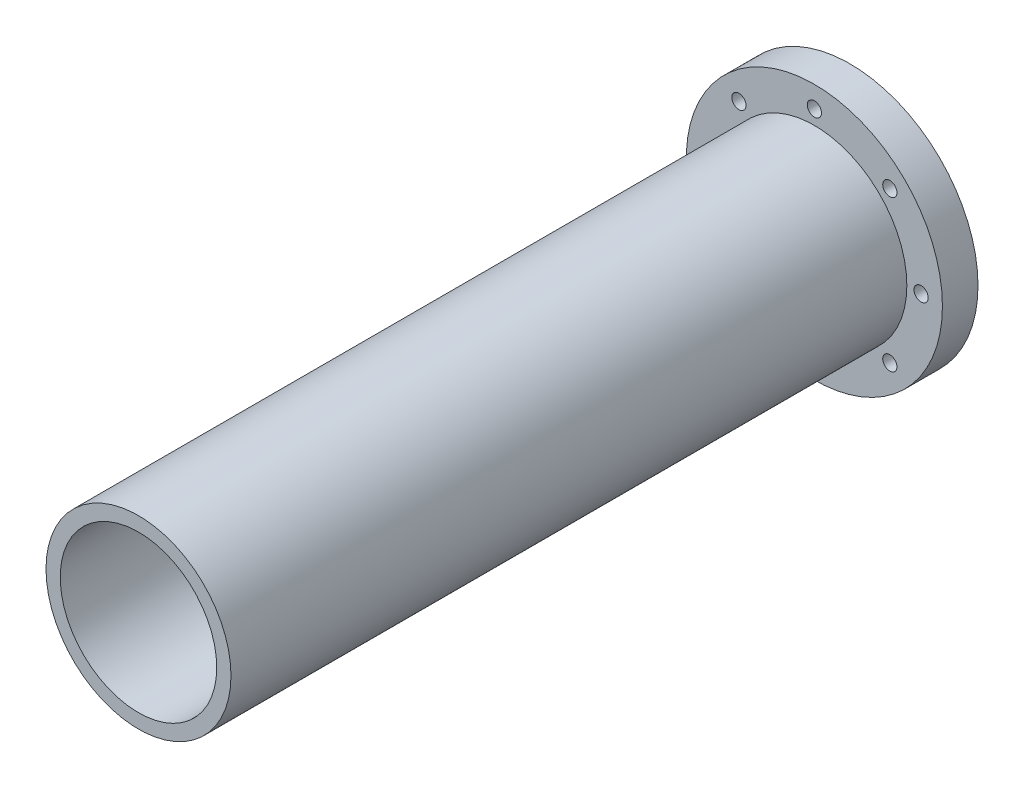
ISO-10303-21;
HEADER;
FILE_DESCRIPTION(('STEP AP214'),'2;1');
FILE_NAME('part.step','',(''),(''),'','','');
FILE_SCHEMA(('AUTOMOTIVE_DESIGN { 1 0 10303 214 1 1 1 1 }'));
ENDSEC;
DATA;
#1=APPLICATION_CONTEXT('core data for automotive mechanical design processes');
#2=APPLICATION_PROTOCOL_DEFINITION('international standard','automotive_design',2000,#1);
#3=PRODUCT_CONTEXT('',#1,'mechanical');
#4=PRODUCT('Part','Part','',(#3));
#5=PRODUCT_RELATED_PRODUCT_CATEGORY('part','',(#4));
#6=PRODUCT_DEFINITION_FORMATION('','',#4);
#7=PRODUCT_DEFINITION_CONTEXT('part definition',#1,'design');
#8=PRODUCT_DEFINITION('design','',#6,#7);
#9=PRODUCT_DEFINITION_SHAPE('','',#8);
#10=(LENGTH_UNIT() NAMED_UNIT(*) SI_UNIT(.MILLI.,.METRE.));
#11=(NAMED_UNIT(*) PLANE_ANGLE_UNIT() SI_UNIT($,.RADIAN.));
#12=(NAMED_UNIT(*) SI_UNIT($,.STERADIAN.) SOLID_ANGLE_UNIT());
#13=UNCERTAINTY_MEASURE_WITH_UNIT(LENGTH_MEASURE(1.E-05),#10,'distance_accuracy_value','');
#14=(GEOMETRIC_REPRESENTATION_CONTEXT(3) GLOBAL_UNCERTAINTY_ASSIGNED_CONTEXT((#13)) GLOBAL_UNIT_ASSIGNED_CONTEXT((#10,
#11,#12)) REPRESENTATION_CONTEXT('',''));
#15=CARTESIAN_POINT('',(0.,0.,0.));
#16=DIRECTION('',(0.,0.,1.));
#17=DIRECTION('',(1.,0.,0.));
#18=AXIS2_PLACEMENT_3D('',#15,#16,#17);
#19=CARTESIAN_POINT('',(0.,0.,500.));
#20=DIRECTION('',(0.,0.,1.));
#21=DIRECTION('',(1.,0.,0.));
#22=AXIS2_PLACEMENT_3D('',#19,#20,#21);
#23=PLANE('',#22);
#24=CARTESIAN_POINT('',(0.,0.,500.));
#25=DIRECTION('',(0.,0.,-1.));
#26=DIRECTION('',(1.,0.,0.));
#27=AXIS2_PLACEMENT_3D('',#24,#25,#26);
#28=CIRCLE('',#27,55.);
#29=CARTESIAN_POINT('',(55.,0.,500.));
#30=VERTEX_POINT('',#29);
#31=EDGE_CURVE('E11',#30,#30,#28,.T.);
#32=ORIENTED_EDGE('',*,*,#31,.T.);
#33=EDGE_LOOP('',(#32));
#34=FACE_BOUND('',#33,.T.);
#35=CARTESIAN_POINT('',(0.,0.,500.));
#36=DIRECTION('',(0.,0.,1.));
#37=DIRECTION('',(1.,0.,0.));
#38=AXIS2_PLACEMENT_3D('',#35,#36,#37);
#39=CIRCLE('',#38,65.);
#40=CARTESIAN_POINT('',(65.,0.,500.));
#41=VERTEX_POINT('',#40);
#42=EDGE_CURVE('E41',#41,#41,#39,.T.);
#43=ORIENTED_EDGE('',*,*,#42,.T.);
#44=EDGE_LOOP('',(#43));
#45=FACE_BOUND('',#44,.T.);
#46=ADVANCED_FACE('F17',(#34,#45),#23,.T.);
#47=CARTESIAN_POINT('',(0.,0.,0.));
#48=DIRECTION('',(0.,0.,-1.));
#49=DIRECTION('',(1.,0.,0.));
#50=AXIS2_PLACEMENT_3D('',#47,#48,#49);
#51=CYLINDRICAL_SURFACE('',#50,55.);
#52=CARTESIAN_POINT('',(0.,0.,0.));
#53=DIRECTION('',(0.,0.,1.));
#54=DIRECTION('',(1.,0.,0.));
#55=AXIS2_PLACEMENT_3D('',#52,#53,#54);
#56=CIRCLE('',#55,55.);
#57=CARTESIAN_POINT('',(55.,0.,0.));
#58=VERTEX_POINT('',#57);
#59=EDGE_CURVE('E140',#58,#58,#56,.T.);
#60=ORIENTED_EDGE('',*,*,#59,.F.);
#61=DIRECTION('',(0.,0.,1.));
#62=VECTOR('',#61,1.);
#63=CARTESIAN_POINT('',(55.,0.,0.));
#64=LINE('',#63,#62);
#65=EDGE_CURVE('E26',#58,#30,#64,.T.);
#66=ORIENTED_EDGE('',*,*,#65,.T.);
#67=ORIENTED_EDGE('',*,*,#31,.F.);
#68=ORIENTED_EDGE('',*,*,#65,.F.);
#69=EDGE_LOOP('',(#60,#66,#67,#68));
#70=FACE_BOUND('',#69,.T.);
#71=ADVANCED_FACE('F19',(#70),#51,.F.);
#72=CARTESIAN_POINT('',(53.033008588991,53.033008588991,0.));
#73=DIRECTION('',(0.,0.,-1.));
#74=DIRECTION('',(1.,0.,0.));
#75=AXIS2_PLACEMENT_3D('',#72,#73,#74);
#76=CYLINDRICAL_SURFACE('',#75,5.);
#77=DIRECTION('',(0.,0.,1.));
#78=VECTOR('',#77,1.);
#79=CARTESIAN_POINT('',(58.033008588991,53.033008588991,0.));
#80=LINE('',#79,#78);
#81=CARTESIAN_POINT('',(58.033008588991,53.033008588991,0.));
#82=VERTEX_POINT('',#81);
#83=CARTESIAN_POINT('',(58.033008588991,53.033008588991,25.));
#84=VERTEX_POINT('',#83);
#85=EDGE_CURVE('E156',#82,#84,#80,.T.);
#86=ORIENTED_EDGE('',*,*,#85,.F.);
#87=CARTESIAN_POINT('',(53.033008588991,53.033008588991,0.));
#88=DIRECTION('',(0.,0.,1.));
#89=DIRECTION('',(1.,0.,0.));
#90=AXIS2_PLACEMENT_3D('',#87,#88,#89);
#91=CIRCLE('',#90,5.);
#92=EDGE_CURVE('E162',#82,#82,#91,.T.);
#93=ORIENTED_EDGE('',*,*,#92,.F.);
#94=ORIENTED_EDGE('',*,*,#85,.T.);
#95=CARTESIAN_POINT('',(53.033008588991,53.033008588991,25.));
#96=DIRECTION('',(0.,0.,-1.));
#97=DIRECTION('',(1.,0.,0.));
#98=AXIS2_PLACEMENT_3D('',#95,#96,#97);
#99=CIRCLE('',#98,5.);
#100=EDGE_CURVE('E151',#84,#84,#99,.T.);
#101=ORIENTED_EDGE('',*,*,#100,.F.);
#102=EDGE_LOOP('',(#86,#93,#94,#101));
#103=FACE_BOUND('',#102,.T.);
#104=ADVANCED_FACE('F200',(#103),#76,.F.);
#105=CARTESIAN_POINT('',(0.,75.,0.));
#106=DIRECTION('',(0.,0.,-1.));
#107=DIRECTION('',(1.,0.,0.));
#108=AXIS2_PLACEMENT_3D('',#105,#106,#107);
#109=CYLINDRICAL_SURFACE('',#108,5.);
#110=DIRECTION('',(0.,0.,1.));
#111=VECTOR('',#110,1.);
#112=CARTESIAN_POINT('',(5.,75.,0.));
#113=LINE('',#112,#111);
#114=CARTESIAN_POINT('',(5.,75.,0.));
#115=VERTEX_POINT('',#114);
#116=CARTESIAN_POINT('',(5.,75.,25.));
#117=VERTEX_POINT('',#116);
#118=EDGE_CURVE('E192',#115,#117,#113,.T.);
#119=ORIENTED_EDGE('',*,*,#118,.F.);
#120=CARTESIAN_POINT('',(0.,75.,0.));
#121=DIRECTION('',(0.,0.,1.));
#122=DIRECTION('',(1.,0.,0.));
#123=AXIS2_PLACEMENT_3D('',#120,#121,#122);
#124=CIRCLE('',#123,5.);
#125=EDGE_CURVE('E171',#115,#115,#124,.T.);
#126=ORIENTED_EDGE('',*,*,#125,.F.);
#127=ORIENTED_EDGE('',*,*,#118,.T.);
#128=CARTESIAN_POINT('',(0.,75.,25.));
#129=DIRECTION('',(0.,0.,-1.));
#130=DIRECTION('',(1.,0.,0.));
#131=AXIS2_PLACEMENT_3D('',#128,#129,#130);
#132=CIRCLE('',#131,5.);
#133=EDGE_CURVE('E204',#117,#117,#132,.T.);
#134=ORIENTED_EDGE('',*,*,#133,.F.);
#135=EDGE_LOOP('',(#119,#126,#127,#134));
#136=FACE_BOUND('',#135,.T.);
#137=ADVANCED_FACE('F285',(#136),#109,.F.);
#138=CARTESIAN_POINT('',(75.,0.,0.));
#139=DIRECTION('',(0.,0.,-1.));
#140=DIRECTION('',(1.,0.,0.));
#141=AXIS2_PLACEMENT_3D('',#138,#139,#140);
#142=CYLINDRICAL_SURFACE('',#141,5.);
#143=DIRECTION('',(0.,0.,1.));
#144=VECTOR('',#143,1.);
#145=CARTESIAN_POINT('',(80.,0.,0.));
#146=LINE('',#145,#144);
#147=CARTESIAN_POINT('',(80.,0.,0.));
#148=VERTEX_POINT('',#147);
#149=CARTESIAN_POINT('',(80.,0.,25.));
#150=VERTEX_POINT('',#149);
#151=EDGE_CURVE('E189',#148,#150,#146,.T.);
#152=ORIENTED_EDGE('',*,*,#151,.F.);
#153=CARTESIAN_POINT('',(75.,0.,0.));
#154=DIRECTION('',(0.,0.,1.));
#155=DIRECTION('',(1.,0.,0.));
#156=AXIS2_PLACEMENT_3D('',#153,#154,#155);
#157=CIRCLE('',#156,5.);
#158=EDGE_CURVE('E158',#148,#148,#157,.T.);
#159=ORIENTED_EDGE('',*,*,#158,.F.);
#160=ORIENTED_EDGE('',*,*,#151,.T.);
#161=CARTESIAN_POINT('',(75.,0.,25.));
#162=DIRECTION('',(0.,0.,-1.));
#163=DIRECTION('',(1.,0.,0.));
#164=AXIS2_PLACEMENT_3D('',#161,#162,#163);
#165=CIRCLE('',#164,5.);
#166=EDGE_CURVE('E208',#150,#150,#165,.T.);
#167=ORIENTED_EDGE('',*,*,#166,.F.);
#168=EDGE_LOOP('',(#152,#159,#160,#167));
#169=FACE_BOUND('',#168,.T.);
#170=ADVANCED_FACE('F295',(#169),#142,.F.);
#171=CARTESIAN_POINT('',(0.,0.,0.));
#172=DIRECTION('',(0.,0.,1.));
#173=DIRECTION('',(1.,0.,0.));
#174=AXIS2_PLACEMENT_3D('',#171,#172,#173);
#175=CYLINDRICAL_SURFACE('',#174,65.);
#176=CARTESIAN_POINT('',(0.,0.,25.));
#177=DIRECTION('',(0.,0.,1.));
#178=DIRECTION('',(1.,0.,0.));
#179=AXIS2_PLACEMENT_3D('',#176,#177,#178);
#180=CIRCLE('',#179,65.);
#181=CARTESIAN_POINT('',(65.,0.,25.));
#182=VERTEX_POINT('',#181);
#183=EDGE_CURVE('E216',#182,#182,#180,.T.);
#184=ORIENTED_EDGE('',*,*,#183,.T.);
#185=DIRECTION('',(0.,0.,1.));
#186=VECTOR('',#185,1.);
#187=CARTESIAN_POINT('',(65.,0.,0.));
#188=LINE('',#187,#186);
#189=EDGE_CURVE('E183',#182,#41,#188,.T.);
#190=ORIENTED_EDGE('',*,*,#189,.T.);
#191=ORIENTED_EDGE('',*,*,#42,.F.);
#192=ORIENTED_EDGE('',*,*,#189,.F.);
#193=EDGE_LOOP('',(#184,#190,#191,#192));
#194=FACE_BOUND('',#193,.T.);
#195=ADVANCED_FACE('F291',(#194),#175,.T.);
#196=CARTESIAN_POINT('',(-53.03300858899,53.033008588991,0.));
#197=DIRECTION('',(0.,0.,-1.));
#198=DIRECTION('',(1.,0.,0.));
#199=AXIS2_PLACEMENT_3D('',#196,#197,#198);
#200=CYLINDRICAL_SURFACE('',#199,5.);
#201=DIRECTION('',(0.,0.,1.));
#202=VECTOR('',#201,1.);
#203=CARTESIAN_POINT('',(-48.03300858899,53.033008588991,0.));
#204=LINE('',#203,#202);
#205=CARTESIAN_POINT('',(-48.03300858899,53.033008588991,0.));
#206=VERTEX_POINT('',#205);
#207=CARTESIAN_POINT('',(-48.03300858899,53.033008588991,25.));
#208=VERTEX_POINT('',#207);
#209=EDGE_CURVE('E182',#206,#208,#204,.T.);
#210=ORIENTED_EDGE('',*,*,#209,.F.);
#211=CARTESIAN_POINT('',(-53.03300858899,53.033008588991,0.));
#212=DIRECTION('',(0.,0.,1.));
#213=DIRECTION('',(1.,0.,0.));
#214=AXIS2_PLACEMENT_3D('',#211,#212,#213);
#215=CIRCLE('',#214,5.);
#216=EDGE_CURVE('E166',#206,#206,#215,.T.);
#217=ORIENTED_EDGE('',*,*,#216,.F.);
#218=ORIENTED_EDGE('',*,*,#209,.T.);
#219=CARTESIAN_POINT('',(-53.03300858899,53.033008588991,25.));
#220=DIRECTION('',(0.,0.,-1.));
#221=DIRECTION('',(1.,0.,0.));
#222=AXIS2_PLACEMENT_3D('',#219,#220,#221);
#223=CIRCLE('',#222,5.);
#224=EDGE_CURVE('E223',#208,#208,#223,.T.);
#225=ORIENTED_EDGE('',*,*,#224,.F.);
#226=EDGE_LOOP('',(#210,#217,#218,#225));
#227=FACE_BOUND('',#226,.T.);
#228=ADVANCED_FACE('F294',(#227),#200,.F.);
#229=CARTESIAN_POINT('',(-75.,0.,0.));
#230=DIRECTION('',(0.,0.,-1.));
#231=DIRECTION('',(1.,0.,0.));
#232=AXIS2_PLACEMENT_3D('',#229,#230,#231);
#233=CYLINDRICAL_SURFACE('',#232,5.);
#234=DIRECTION('',(0.,0.,1.));
#235=VECTOR('',#234,1.);
#236=CARTESIAN_POINT('',(-70.,0.,0.));
#237=LINE('',#236,#235);
#238=CARTESIAN_POINT('',(-70.,0.,0.));
#239=VERTEX_POINT('',#238);
#240=CARTESIAN_POINT('',(-70.,0.,25.));
#241=VERTEX_POINT('',#240);
#242=EDGE_CURVE('E132',#239,#241,#237,.T.);
#243=ORIENTED_EDGE('',*,*,#242,.F.);
#244=CARTESIAN_POINT('',(-75.,0.,0.));
#245=DIRECTION('',(0.,0.,1.));
#246=DIRECTION('',(1.,0.,0.));
#247=AXIS2_PLACEMENT_3D('',#244,#245,#246);
#248=CIRCLE('',#247,5.);
#249=EDGE_CURVE('E170',#239,#239,#248,.T.);
#250=ORIENTED_EDGE('',*,*,#249,.F.);
#251=ORIENTED_EDGE('',*,*,#242,.T.);
#252=CARTESIAN_POINT('',(-75.,0.,25.));
#253=DIRECTION('',(0.,0.,-1.));
#254=DIRECTION('',(1.,0.,0.));
#255=AXIS2_PLACEMENT_3D('',#252,#253,#254);
#256=CIRCLE('',#255,5.);
#257=EDGE_CURVE('E221',#241,#241,#256,.T.);
#258=ORIENTED_EDGE('',*,*,#257,.F.);
#259=EDGE_LOOP('',(#243,#250,#251,#258));
#260=FACE_BOUND('',#259,.T.);
#261=ADVANCED_FACE('F296',(#260),#233,.F.);
#262=CARTESIAN_POINT('',(53.033008588991,-53.03300858899,0.));
#263=DIRECTION('',(0.,0.,-1.));
#264=DIRECTION('',(1.,0.,0.));
#265=AXIS2_PLACEMENT_3D('',#262,#263,#264);
#266=CYLINDRICAL_SURFACE('',#265,5.);
#267=DIRECTION('',(0.,0.,1.));
#268=VECTOR('',#267,1.);
#269=CARTESIAN_POINT('',(58.033008588991,-53.03300858899,0.));
#270=LINE('',#269,#268);
#271=CARTESIAN_POINT('',(58.033008588991,-53.03300858899,0.));
#272=VERTEX_POINT('',#271);
#273=CARTESIAN_POINT('',(58.033008588991,-53.03300858899,25.));
#274=VERTEX_POINT('',#273);
#275=EDGE_CURVE('E125',#272,#274,#270,.T.);
#276=ORIENTED_EDGE('',*,*,#275,.F.);
#277=CARTESIAN_POINT('',(53.033008588991,-53.03300858899,0.));
#278=DIRECTION('',(0.,0.,1.));
#279=DIRECTION('',(1.,0.,0.));
#280=AXIS2_PLACEMENT_3D('',#277,#278,#279);
#281=CIRCLE('',#280,5.);
#282=EDGE_CURVE('E128',#272,#272,#281,.T.);
#283=ORIENTED_EDGE('',*,*,#282,.F.);
#284=ORIENTED_EDGE('',*,*,#275,.T.);
#285=CARTESIAN_POINT('',(53.033008588991,-53.03300858899,25.));
#286=DIRECTION('',(0.,0.,-1.));
#287=DIRECTION('',(1.,0.,0.));
#288=AXIS2_PLACEMENT_3D('',#285,#286,#287);
#289=CIRCLE('',#288,5.);
#290=EDGE_CURVE('E130',#274,#274,#289,.T.);
#291=ORIENTED_EDGE('',*,*,#290,.F.);
#292=EDGE_LOOP('',(#276,#283,#284,#291));
#293=FACE_BOUND('',#292,.T.);
#294=ADVANCED_FACE('F127',(#293),#266,.F.);
#295=CARTESIAN_POINT('',(0.,-75.,0.));
#296=DIRECTION('',(0.,0.,-1.));
#297=DIRECTION('',(1.,0.,0.));
#298=AXIS2_PLACEMENT_3D('',#295,#296,#297);
#299=CYLINDRICAL_SURFACE('',#298,5.);
#300=DIRECTION('',(0.,0.,1.));
#301=VECTOR('',#300,1.);
#302=CARTESIAN_POINT('',(5.,-75.,0.));
#303=LINE('',#302,#301);
#304=CARTESIAN_POINT('',(5.,-75.,0.));
#305=VERTEX_POINT('',#304);
#306=CARTESIAN_POINT('',(5.,-75.,25.));
#307=VERTEX_POINT('',#306);
#308=EDGE_CURVE('E133',#305,#307,#303,.T.);
#309=ORIENTED_EDGE('',*,*,#308,.F.);
#310=CARTESIAN_POINT('',(0.,-75.,0.));
#311=DIRECTION('',(0.,0.,1.));
#312=DIRECTION('',(1.,0.,0.));
#313=AXIS2_PLACEMENT_3D('',#310,#311,#312);
#314=CIRCLE('',#313,5.);
#315=EDGE_CURVE('E139',#305,#305,#314,.T.);
#316=ORIENTED_EDGE('',*,*,#315,.F.);
#317=ORIENTED_EDGE('',*,*,#308,.T.);
#318=CARTESIAN_POINT('',(0.,-75.,25.));
#319=DIRECTION('',(0.,0.,-1.));
#320=DIRECTION('',(1.,0.,0.));
#321=AXIS2_PLACEMENT_3D('',#318,#319,#320);
#322=CIRCLE('',#321,5.);
#323=EDGE_CURVE('E243',#307,#307,#322,.T.);
#324=ORIENTED_EDGE('',*,*,#323,.F.);
#325=EDGE_LOOP('',(#309,#316,#317,#324));
#326=FACE_BOUND('',#325,.T.);
#327=ADVANCED_FACE('F302',(#326),#299,.F.);
#328=CARTESIAN_POINT('',(-53.03300858899,-53.03300858899,0.));
#329=DIRECTION('',(0.,0.,-1.));
#330=DIRECTION('',(1.,0.,0.));
#331=AXIS2_PLACEMENT_3D('',#328,#329,#330);
#332=CYLINDRICAL_SURFACE('',#331,5.);
#333=DIRECTION('',(0.,0.,1.));
#334=VECTOR('',#333,1.);
#335=CARTESIAN_POINT('',(-48.03300858899,-53.03300858899,0.));
#336=LINE('',#335,#334);
#337=CARTESIAN_POINT('',(-48.03300858899,-53.03300858899,0.));
#338=VERTEX_POINT('',#337);
#339=CARTESIAN_POINT('',(-48.03300858899,-53.03300858899,25.));
#340=VERTEX_POINT('',#339);
#341=EDGE_CURVE('E174',#338,#340,#336,.T.);
#342=ORIENTED_EDGE('',*,*,#341,.F.);
#343=CARTESIAN_POINT('',(-53.03300858899,-53.03300858899,0.));
#344=DIRECTION('',(0.,0.,1.));
#345=DIRECTION('',(1.,0.,0.));
#346=AXIS2_PLACEMENT_3D('',#343,#344,#345);
#347=CIRCLE('',#346,5.);
#348=EDGE_CURVE('E147',#338,#338,#347,.T.);
#349=ORIENTED_EDGE('',*,*,#348,.F.);
#350=ORIENTED_EDGE('',*,*,#341,.T.);
#351=CARTESIAN_POINT('',(-53.03300858899,-53.03300858899,25.));
#352=DIRECTION('',(0.,0.,-1.));
#353=DIRECTION('',(1.,0.,0.));
#354=AXIS2_PLACEMENT_3D('',#351,#352,#353);
#355=CIRCLE('',#354,5.);
#356=EDGE_CURVE('E241',#340,#340,#355,.T.);
#357=ORIENTED_EDGE('',*,*,#356,.F.);
#358=EDGE_LOOP('',(#342,#349,#350,#357));
#359=FACE_BOUND('',#358,.T.);
#360=ADVANCED_FACE('F274',(#359),#332,.F.);
#361=CARTESIAN_POINT('',(0.,0.,0.));
#362=DIRECTION('',(0.,0.,1.));
#363=DIRECTION('',(1.,0.,0.));
#364=AXIS2_PLACEMENT_3D('',#361,#362,#363);
#365=PLANE('',#364);
#366=ORIENTED_EDGE('',*,*,#125,.T.);
#367=EDGE_LOOP('',(#366));
#368=FACE_BOUND('',#367,.T.);
#369=ORIENTED_EDGE('',*,*,#249,.T.);
#370=EDGE_LOOP('',(#369));
#371=FACE_BOUND('',#370,.T.);
#372=ORIENTED_EDGE('',*,*,#216,.T.);
#373=EDGE_LOOP('',(#372));
#374=FACE_BOUND('',#373,.T.);
#375=ORIENTED_EDGE('',*,*,#92,.T.);
#376=EDGE_LOOP('',(#375));
#377=FACE_BOUND('',#376,.T.);
#378=ORIENTED_EDGE('',*,*,#158,.T.);
#379=EDGE_LOOP('',(#378));
#380=FACE_BOUND('',#379,.T.);
#381=ORIENTED_EDGE('',*,*,#348,.T.);
#382=EDGE_LOOP('',(#381));
#383=FACE_BOUND('',#382,.T.);
#384=ORIENTED_EDGE('',*,*,#315,.T.);
#385=EDGE_LOOP('',(#384));
#386=FACE_BOUND('',#385,.T.);
#387=ORIENTED_EDGE('',*,*,#282,.T.);
#388=EDGE_LOOP('',(#387));
#389=FACE_BOUND('',#388,.T.);
#390=CARTESIAN_POINT('',(0.,0.,0.));
#391=DIRECTION('',(0.,0.,1.));
#392=DIRECTION('',(1.,0.,0.));
#393=AXIS2_PLACEMENT_3D('',#390,#391,#392);
#394=CIRCLE('',#393,90.);
#395=CARTESIAN_POINT('',(90.,0.,0.));
#396=VERTEX_POINT('',#395);
#397=EDGE_CURVE('E259',#396,#396,#394,.T.);
#398=ORIENTED_EDGE('',*,*,#397,.F.);
#399=EDGE_LOOP('',(#398));
#400=FACE_BOUND('',#399,.T.);
#401=ORIENTED_EDGE('',*,*,#59,.T.);
#402=EDGE_LOOP('',(#401));
#403=FACE_BOUND('',#402,.T.);
#404=ADVANCED_FACE('F136',(#368,#371,#374,#377,#380,#383,#386,#389,#400,#403),#365,.F.);
#405=CARTESIAN_POINT('',(0.,0.,25.));
#406=DIRECTION('',(0.,0.,1.));
#407=DIRECTION('',(1.,0.,0.));
#408=AXIS2_PLACEMENT_3D('',#405,#406,#407);
#409=PLANE('',#408);
#410=ORIENTED_EDGE('',*,*,#100,.T.);
#411=EDGE_LOOP('',(#410));
#412=FACE_BOUND('',#411,.T.);
#413=ORIENTED_EDGE('',*,*,#133,.T.);
#414=EDGE_LOOP('',(#413));
#415=FACE_BOUND('',#414,.T.);
#416=ORIENTED_EDGE('',*,*,#166,.T.);
#417=EDGE_LOOP('',(#416));
#418=FACE_BOUND('',#417,.T.);
#419=ORIENTED_EDGE('',*,*,#183,.F.);
#420=EDGE_LOOP('',(#419));
#421=FACE_BOUND('',#420,.T.);
#422=ORIENTED_EDGE('',*,*,#224,.T.);
#423=EDGE_LOOP('',(#422));
#424=FACE_BOUND('',#423,.T.);
#425=ORIENTED_EDGE('',*,*,#257,.T.);
#426=EDGE_LOOP('',(#425));
#427=FACE_BOUND('',#426,.T.);
#428=ORIENTED_EDGE('',*,*,#290,.T.);
#429=EDGE_LOOP('',(#428));
#430=FACE_BOUND('',#429,.T.);
#431=ORIENTED_EDGE('',*,*,#323,.T.);
#432=EDGE_LOOP('',(#431));
#433=FACE_BOUND('',#432,.T.);
#434=ORIENTED_EDGE('',*,*,#356,.T.);
#435=EDGE_LOOP('',(#434));
#436=FACE_BOUND('',#435,.T.);
#437=CARTESIAN_POINT('',(0.,0.,25.));
#438=DIRECTION('',(0.,0.,1.));
#439=DIRECTION('',(1.,0.,0.));
#440=AXIS2_PLACEMENT_3D('',#437,#438,#439);
#441=CIRCLE('',#440,90.);
#442=CARTESIAN_POINT('',(90.,0.,25.));
#443=VERTEX_POINT('',#442);
#444=EDGE_CURVE('E244',#443,#443,#441,.T.);
#445=ORIENTED_EDGE('',*,*,#444,.T.);
#446=EDGE_LOOP('',(#445));
#447=FACE_BOUND('',#446,.T.);
#448=ADVANCED_FACE('F202',(#412,#415,#418,#421,#424,#427,#430,#433,#436,#447),#409,.T.);
#449=CARTESIAN_POINT('',(0.,0.,0.));
#450=DIRECTION('',(0.,0.,1.));
#451=DIRECTION('',(1.,0.,0.));
#452=AXIS2_PLACEMENT_3D('',#449,#450,#451);
#453=CYLINDRICAL_SURFACE('',#452,90.);
#454=DIRECTION('',(0.,0.,1.));
#455=VECTOR('',#454,1.);
#456=CARTESIAN_POINT('',(90.,0.,0.));
#457=LINE('',#456,#455);
#458=EDGE_CURVE('E256',#396,#443,#457,.T.);
#459=ORIENTED_EDGE('',*,*,#458,.F.);
#460=ORIENTED_EDGE('',*,*,#397,.T.);
#461=ORIENTED_EDGE('',*,*,#458,.T.);
#462=ORIENTED_EDGE('',*,*,#444,.F.);
#463=EDGE_LOOP('',(#459,#460,#461,#462));
#464=FACE_BOUND('',#463,.T.);
#465=ADVANCED_FACE('F270',(#464),#453,.T.);
#466=CLOSED_SHELL('',(#46,#71,#104,#137,#170,#195,#228,#261,#294,#327,#360,#404,#448,#465));
#467=MANIFOLD_SOLID_BREP('B1',#466);
#468=ADVANCED_BREP_SHAPE_REPRESENTATION('',(#18,#467),#14);
#469=SHAPE_DEFINITION_REPRESENTATION(#9,#468);
ENDSEC;
END-ISO-10303-21;
